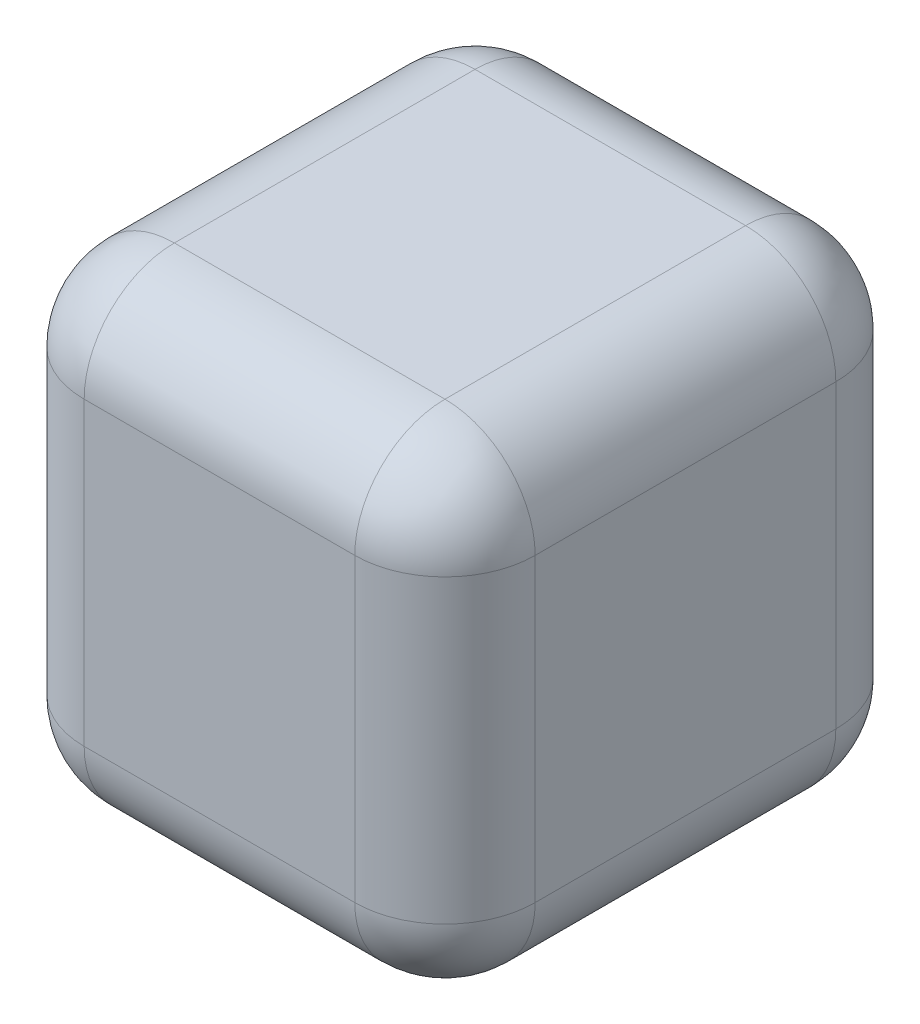
ISO-10303-21;
HEADER;
FILE_DESCRIPTION(('STEP AP214'),'2;1');
FILE_NAME('part.step','',(''),(''),'','','');
FILE_SCHEMA(('AUTOMOTIVE_DESIGN { 1 0 10303 214 1 1 1 1 }'));
ENDSEC;
DATA;
#1=APPLICATION_CONTEXT('core data for automotive mechanical design processes');
#2=APPLICATION_PROTOCOL_DEFINITION('international standard','automotive_design',2000,#1);
#3=PRODUCT_CONTEXT('',#1,'mechanical');
#4=PRODUCT('Part','Part','',(#3));
#5=PRODUCT_RELATED_PRODUCT_CATEGORY('part','',(#4));
#6=PRODUCT_DEFINITION_FORMATION('','',#4);
#7=PRODUCT_DEFINITION_CONTEXT('part definition',#1,'design');
#8=PRODUCT_DEFINITION('design','',#6,#7);
#9=PRODUCT_DEFINITION_SHAPE('','',#8);
#10=(LENGTH_UNIT() NAMED_UNIT(*) SI_UNIT(.MILLI.,.METRE.));
#11=(NAMED_UNIT(*) PLANE_ANGLE_UNIT() SI_UNIT($,.RADIAN.));
#12=(NAMED_UNIT(*) SI_UNIT($,.STERADIAN.) SOLID_ANGLE_UNIT());
#13=UNCERTAINTY_MEASURE_WITH_UNIT(LENGTH_MEASURE(1.E-05),#10,'distance_accuracy_value','');
#14=(GEOMETRIC_REPRESENTATION_CONTEXT(3) GLOBAL_UNCERTAINTY_ASSIGNED_CONTEXT((#13)) GLOBAL_UNIT_ASSIGNED_CONTEXT((#10,
#11,#12)) REPRESENTATION_CONTEXT('',''));
#15=CARTESIAN_POINT('',(0.,0.,0.));
#16=DIRECTION('',(0.,0.,1.));
#17=DIRECTION('',(1.,0.,0.));
#18=AXIS2_PLACEMENT_3D('',#15,#16,#17);
#19=CARTESIAN_POINT('',(63.5,-16.,16.));
#20=DIRECTION('',(0.,0.,-1.));
#21=DIRECTION('',(-1.,0.,0.));
#22=AXIS2_PLACEMENT_3D('',#19,#20,#21);
#23=PLANE('',#22);
#24=DIRECTION('',(0.,-1.,0.));
#25=VECTOR('',#24,1.);
#26=CARTESIAN_POINT('',(57.5,-16.,16.));
#27=LINE('',#26,#25);
#28=CARTESIAN_POINT('',(57.5,-10.,16.));
#29=VERTEX_POINT('',#28);
#30=CARTESIAN_POINT('',(57.5,10.,16.));
#31=VERTEX_POINT('',#30);
#32=EDGE_CURVE('E164',#29,#31,#27,.F.);
#33=ORIENTED_EDGE('',*,*,#32,.T.);
#34=DIRECTION('',(-1.,0.,0.));
#35=VECTOR('',#34,1.);
#36=CARTESIAN_POINT('',(63.5,10.,16.));
#37=LINE('',#36,#35);
#38=CARTESIAN_POINT('',(39.5,10.,16.));
#39=VERTEX_POINT('',#38);
#40=EDGE_CURVE('E167',#31,#39,#37,.T.);
#41=ORIENTED_EDGE('',*,*,#40,.T.);
#42=DIRECTION('',(0.,-1.,0.));
#43=VECTOR('',#42,1.);
#44=CARTESIAN_POINT('',(39.5,-16.,16.));
#45=LINE('',#44,#43);
#46=CARTESIAN_POINT('',(39.5,-10.,16.));
#47=VERTEX_POINT('',#46);
#48=EDGE_CURVE('E137',#39,#47,#45,.T.);
#49=ORIENTED_EDGE('',*,*,#48,.T.);
#50=DIRECTION('',(-1.,0.,0.));
#51=VECTOR('',#50,1.);
#52=CARTESIAN_POINT('',(63.5,-10.,16.));
#53=LINE('',#52,#51);
#54=EDGE_CURVE('E158',#47,#29,#53,.F.);
#55=ORIENTED_EDGE('',*,*,#54,.T.);
#56=EDGE_LOOP('',(#33,#41,#49,#55));
#57=FACE_BOUND('',#56,.T.);
#58=ADVANCED_FACE('F39',(#57),#23,.F.);
#59=CARTESIAN_POINT('',(63.5,-16.,16.));
#60=DIRECTION('',(0.,1.,0.));
#61=DIRECTION('',(0.,0.,1.));
#62=AXIS2_PLACEMENT_3D('',#59,#60,#61);
#63=PLANE('',#62);
#64=DIRECTION('',(0.,0.,-1.));
#65=VECTOR('',#64,1.);
#66=CARTESIAN_POINT('',(39.5,-16.,-16.));
#67=LINE('',#66,#65);
#68=CARTESIAN_POINT('',(39.5,-16.,10.));
#69=VERTEX_POINT('',#68);
#70=CARTESIAN_POINT('',(39.5,-16.,-10.));
#71=VERTEX_POINT('',#70);
#72=EDGE_CURVE('E193',#69,#71,#67,.T.);
#73=ORIENTED_EDGE('',*,*,#72,.T.);
#74=DIRECTION('',(-1.,0.,0.));
#75=VECTOR('',#74,1.);
#76=CARTESIAN_POINT('',(63.5,-16.,-10.));
#77=LINE('',#76,#75);
#78=CARTESIAN_POINT('',(57.5,-16.,-10.));
#79=VERTEX_POINT('',#78);
#80=EDGE_CURVE('E197',#71,#79,#77,.F.);
#81=ORIENTED_EDGE('',*,*,#80,.T.);
#82=DIRECTION('',(0.,0.,-1.));
#83=VECTOR('',#82,1.);
#84=CARTESIAN_POINT('',(57.5,-16.,16.));
#85=LINE('',#84,#83);
#86=CARTESIAN_POINT('',(57.5,-16.,10.));
#87=VERTEX_POINT('',#86);
#88=EDGE_CURVE('E190',#79,#87,#85,.F.);
#89=ORIENTED_EDGE('',*,*,#88,.T.);
#90=DIRECTION('',(-1.,0.,0.));
#91=VECTOR('',#90,1.);
#92=CARTESIAN_POINT('',(63.5,-16.,10.));
#93=LINE('',#92,#91);
#94=EDGE_CURVE('E187',#87,#69,#93,.T.);
#95=ORIENTED_EDGE('',*,*,#94,.T.);
#96=EDGE_LOOP('',(#73,#81,#89,#95));
#97=FACE_BOUND('',#96,.T.);
#98=ADVANCED_FACE('F378',(#97),#63,.F.);
#99=CARTESIAN_POINT('',(63.5,-16.,-16.));
#100=DIRECTION('',(0.,0.,1.));
#101=DIRECTION('',(1.,0.,0.));
#102=AXIS2_PLACEMENT_3D('',#99,#100,#101);
#103=PLANE('',#102);
#104=DIRECTION('',(0.,1.,0.));
#105=VECTOR('',#104,1.);
#106=CARTESIAN_POINT('',(39.5,16.,-16.));
#107=LINE('',#106,#105);
#108=CARTESIAN_POINT('',(39.5,-10.,-16.));
#109=VERTEX_POINT('',#108);
#110=CARTESIAN_POINT('',(39.5,10.,-16.));
#111=VERTEX_POINT('',#110);
#112=EDGE_CURVE('E206',#109,#111,#107,.T.);
#113=ORIENTED_EDGE('',*,*,#112,.T.);
#114=DIRECTION('',(-1.,0.,0.));
#115=VECTOR('',#114,1.);
#116=CARTESIAN_POINT('',(63.5,10.,-16.));
#117=LINE('',#116,#115);
#118=CARTESIAN_POINT('',(57.5,10.,-16.));
#119=VERTEX_POINT('',#118);
#120=EDGE_CURVE('E210',#111,#119,#117,.F.);
#121=ORIENTED_EDGE('',*,*,#120,.T.);
#122=DIRECTION('',(0.,1.,0.));
#123=VECTOR('',#122,1.);
#124=CARTESIAN_POINT('',(57.5,-16.,-16.));
#125=LINE('',#124,#123);
#126=CARTESIAN_POINT('',(57.5,-10.,-16.));
#127=VERTEX_POINT('',#126);
#128=EDGE_CURVE('E203',#119,#127,#125,.F.);
#129=ORIENTED_EDGE('',*,*,#128,.T.);
#130=DIRECTION('',(-1.,0.,0.));
#131=VECTOR('',#130,1.);
#132=CARTESIAN_POINT('',(63.5,-10.,-16.));
#133=LINE('',#132,#131);
#134=EDGE_CURVE('E200',#127,#109,#133,.T.);
#135=ORIENTED_EDGE('',*,*,#134,.T.);
#136=EDGE_LOOP('',(#113,#121,#129,#135));
#137=FACE_BOUND('',#136,.T.);
#138=ADVANCED_FACE('F348',(#137),#103,.F.);
#139=CARTESIAN_POINT('',(63.5,16.,16.));
#140=DIRECTION('',(0.,-1.,0.));
#141=DIRECTION('',(0.,0.,-1.));
#142=AXIS2_PLACEMENT_3D('',#139,#140,#141);
#143=PLANE('',#142);
#144=DIRECTION('',(0.,0.,1.));
#145=VECTOR('',#144,1.);
#146=CARTESIAN_POINT('',(39.5,16.,16.));
#147=LINE('',#146,#145);
#148=CARTESIAN_POINT('',(39.5,16.,-10.));
#149=VERTEX_POINT('',#148);
#150=CARTESIAN_POINT('',(39.5,16.,10.));
#151=VERTEX_POINT('',#150);
#152=EDGE_CURVE('E219',#149,#151,#147,.T.);
#153=ORIENTED_EDGE('',*,*,#152,.T.);
#154=DIRECTION('',(-1.,0.,0.));
#155=VECTOR('',#154,1.);
#156=CARTESIAN_POINT('',(63.5,16.,10.));
#157=LINE('',#156,#155);
#158=CARTESIAN_POINT('',(57.5,16.,10.));
#159=VERTEX_POINT('',#158);
#160=EDGE_CURVE('E223',#151,#159,#157,.F.);
#161=ORIENTED_EDGE('',*,*,#160,.T.);
#162=DIRECTION('',(0.,0.,1.));
#163=VECTOR('',#162,1.);
#164=CARTESIAN_POINT('',(57.5,16.,16.));
#165=LINE('',#164,#163);
#166=CARTESIAN_POINT('',(57.5,16.,-10.));
#167=VERTEX_POINT('',#166);
#168=EDGE_CURVE('E216',#159,#167,#165,.F.);
#169=ORIENTED_EDGE('',*,*,#168,.T.);
#170=DIRECTION('',(-1.,0.,0.));
#171=VECTOR('',#170,1.);
#172=CARTESIAN_POINT('',(63.5,16.,-10.));
#173=LINE('',#172,#171);
#174=EDGE_CURVE('E213',#167,#149,#173,.T.);
#175=ORIENTED_EDGE('',*,*,#174,.T.);
#176=EDGE_LOOP('',(#153,#161,#169,#175));
#177=FACE_BOUND('',#176,.T.);
#178=ADVANCED_FACE('F324',(#177),#143,.F.);
#179=CARTESIAN_POINT('',(63.5,0.,0.));
#180=DIRECTION('',(-1.,0.,0.));
#181=DIRECTION('',(0.,0.,1.));
#182=AXIS2_PLACEMENT_3D('',#179,#180,#181);
#183=PLANE('',#182);
#184=DIRECTION('',(0.,0.,1.));
#185=VECTOR('',#184,1.);
#186=CARTESIAN_POINT('',(63.5,10.,0.));
#187=LINE('',#186,#185);
#188=CARTESIAN_POINT('',(63.5,10.,-10.));
#189=VERTEX_POINT('',#188);
#190=CARTESIAN_POINT('',(63.5,10.,10.));
#191=VERTEX_POINT('',#190);
#192=EDGE_CURVE('E226',#189,#191,#187,.T.);
#193=ORIENTED_EDGE('',*,*,#192,.T.);
#194=DIRECTION('',(0.,-1.,0.));
#195=VECTOR('',#194,1.);
#196=CARTESIAN_POINT('',(63.5,0.,10.));
#197=LINE('',#196,#195);
#198=CARTESIAN_POINT('',(63.5,-10.,10.));
#199=VERTEX_POINT('',#198);
#200=EDGE_CURVE('E11',#191,#199,#197,.T.);
#201=ORIENTED_EDGE('',*,*,#200,.T.);
#202=DIRECTION('',(0.,0.,-1.));
#203=VECTOR('',#202,1.);
#204=CARTESIAN_POINT('',(63.5,-10.,0.));
#205=LINE('',#204,#203);
#206=CARTESIAN_POINT('',(63.5,-10.,-10.));
#207=VERTEX_POINT('',#206);
#208=EDGE_CURVE('E49',#199,#207,#205,.T.);
#209=ORIENTED_EDGE('',*,*,#208,.T.);
#210=DIRECTION('',(0.,1.,0.));
#211=VECTOR('',#210,1.);
#212=CARTESIAN_POINT('',(63.5,0.,-10.));
#213=LINE('',#212,#211);
#214=EDGE_CURVE('E229',#207,#189,#213,.T.);
#215=ORIENTED_EDGE('',*,*,#214,.T.);
#216=EDGE_LOOP('',(#193,#201,#209,#215));
#217=FACE_BOUND('',#216,.T.);
#218=ADVANCED_FACE('F332',(#217),#183,.F.);
#219=CARTESIAN_POINT('',(33.5,0.,0.));
#220=DIRECTION('',(-1.,0.,0.));
#221=DIRECTION('',(0.,0.,1.));
#222=AXIS2_PLACEMENT_3D('',#219,#220,#221);
#223=PLANE('',#222);
#224=CARTESIAN_POINT('',(33.5,-4.5,-4.5));
#225=DIRECTION('',(1.,0.,0.));
#226=DIRECTION('',(0.,0.,-1.));
#227=AXIS2_PLACEMENT_3D('',#224,#225,#226);
#228=CIRCLE('',#227,0.8);
#229=CARTESIAN_POINT('',(33.5,-4.5,-5.3));
#230=VERTEX_POINT('',#229);
#231=EDGE_CURVE('E661',#230,#230,#228,.T.);
#232=ORIENTED_EDGE('',*,*,#231,.T.);
#233=EDGE_LOOP('',(#232));
#234=FACE_BOUND('',#233,.T.);
#235=CARTESIAN_POINT('',(33.5,4.5,4.5));
#236=DIRECTION('',(1.,0.,0.));
#237=DIRECTION('',(0.,0.,-1.));
#238=AXIS2_PLACEMENT_3D('',#235,#236,#237);
#239=CIRCLE('',#238,0.8);
#240=CARTESIAN_POINT('',(33.5,4.5,3.7));
#241=VERTEX_POINT('',#240);
#242=EDGE_CURVE('E676',#241,#241,#239,.T.);
#243=ORIENTED_EDGE('',*,*,#242,.T.);
#244=EDGE_LOOP('',(#243));
#245=FACE_BOUND('',#244,.T.);
#246=CARTESIAN_POINT('',(33.5,4.5,-4.5));
#247=DIRECTION('',(1.,0.,0.));
#248=DIRECTION('',(0.,0.,-1.));
#249=AXIS2_PLACEMENT_3D('',#246,#247,#248);
#250=CIRCLE('',#249,0.8);
#251=CARTESIAN_POINT('',(33.5,4.5,-5.3));
#252=VERTEX_POINT('',#251);
#253=EDGE_CURVE('E670',#252,#252,#250,.T.);
#254=ORIENTED_EDGE('',*,*,#253,.T.);
#255=EDGE_LOOP('',(#254));
#256=FACE_BOUND('',#255,.T.);
#257=CARTESIAN_POINT('',(33.5,-4.5,4.5));
#258=DIRECTION('',(1.,0.,0.));
#259=DIRECTION('',(0.,0.,-1.));
#260=AXIS2_PLACEMENT_3D('',#257,#258,#259);
#261=CIRCLE('',#260,0.8);
#262=CARTESIAN_POINT('',(33.5,-4.5,3.7));
#263=VERTEX_POINT('',#262);
#264=EDGE_CURVE('E660',#263,#263,#261,.T.);
#265=ORIENTED_EDGE('',*,*,#264,.T.);
#266=EDGE_LOOP('',(#265));
#267=FACE_BOUND('',#266,.T.);
#268=DIRECTION('',(0.,0.,-1.));
#269=VECTOR('',#268,1.);
#270=CARTESIAN_POINT('',(33.5,-10.,16.));
#271=LINE('',#270,#269);
#272=CARTESIAN_POINT('',(33.5,-10.,-10.));
#273=VERTEX_POINT('',#272);
#274=CARTESIAN_POINT('',(33.5,-10.,10.));
#275=VERTEX_POINT('',#274);
#276=EDGE_CURVE('E182',#273,#275,#271,.F.);
#277=ORIENTED_EDGE('',*,*,#276,.T.);
#278=DIRECTION('',(0.,-1.,0.));
#279=VECTOR('',#278,1.);
#280=CARTESIAN_POINT('',(33.5,16.,10.));
#281=LINE('',#280,#279);
#282=CARTESIAN_POINT('',(33.5,10.,10.));
#283=VERTEX_POINT('',#282);
#284=EDGE_CURVE('E139',#275,#283,#281,.F.);
#285=ORIENTED_EDGE('',*,*,#284,.T.);
#286=DIRECTION('',(0.,0.,1.));
#287=VECTOR('',#286,1.);
#288=CARTESIAN_POINT('',(33.5,10.,-16.));
#289=LINE('',#288,#287);
#290=CARTESIAN_POINT('',(33.5,10.,-10.));
#291=VERTEX_POINT('',#290);
#292=EDGE_CURVE('E173',#283,#291,#289,.F.);
#293=ORIENTED_EDGE('',*,*,#292,.T.);
#294=DIRECTION('',(0.,1.,0.));
#295=VECTOR('',#294,1.);
#296=CARTESIAN_POINT('',(33.5,-16.,-10.));
#297=LINE('',#296,#295);
#298=EDGE_CURVE('E179',#291,#273,#297,.F.);
#299=ORIENTED_EDGE('',*,*,#298,.T.);
#300=EDGE_LOOP('',(#277,#285,#293,#299));
#301=FACE_BOUND('',#300,.T.);
#302=ADVANCED_FACE('F412',(#234,#245,#256,#267,#301),#223,.T.);
#303=CARTESIAN_POINT('',(57.5,0.,-10.));
#304=DIRECTION('',(0.,1.,0.));
#305=DIRECTION('',(0.,0.,1.));
#306=AXIS2_PLACEMENT_3D('',#303,#304,#305);
#307=CYLINDRICAL_SURFACE('',#306,6.);
#308=CARTESIAN_POINT('',(57.5,10.,-10.));
#309=DIRECTION('',(0.,1.,0.));
#310=DIRECTION('',(0.,0.,1.));
#311=AXIS2_PLACEMENT_3D('',#308,#309,#310);
#312=CIRCLE('',#311,6.);
#313=EDGE_CURVE('E43',#189,#119,#312,.T.);
#314=ORIENTED_EDGE('',*,*,#313,.F.);
#315=ORIENTED_EDGE('',*,*,#214,.F.);
#316=CARTESIAN_POINT('',(57.5,-10.,-10.));
#317=DIRECTION('',(0.,-1.,0.));
#318=DIRECTION('',(0.,0.,-1.));
#319=AXIS2_PLACEMENT_3D('',#316,#317,#318);
#320=CIRCLE('',#319,6.);
#321=EDGE_CURVE('E300',#127,#207,#320,.T.);
#322=ORIENTED_EDGE('',*,*,#321,.F.);
#323=ORIENTED_EDGE('',*,*,#128,.F.);
#324=EDGE_LOOP('',(#314,#315,#322,#323));
#325=FACE_BOUND('',#324,.T.);
#326=ADVANCED_FACE('F41',(#325),#307,.T.);
#327=CARTESIAN_POINT('',(57.5,10.,-10.));
#328=DIRECTION('',(0.,0.,-1.));
#329=DIRECTION('',(-1.,0.,0.));
#330=AXIS2_PLACEMENT_3D('',#327,#328,#329);
#331=SPHERICAL_SURFACE('',#330,6.);
#332=CARTESIAN_POINT('',(57.5,10.,-10.));
#333=DIRECTION('',(0.,0.,-1.));
#334=DIRECTION('',(-1.,0.,0.));
#335=AXIS2_PLACEMENT_3D('',#332,#333,#334);
#336=CIRCLE('',#335,6.);
#337=EDGE_CURVE('E293',#189,#167,#336,.F.);
#338=ORIENTED_EDGE('',*,*,#337,.F.);
#339=ORIENTED_EDGE('',*,*,#313,.T.);
#340=CARTESIAN_POINT('',(57.5,10.,-10.));
#341=DIRECTION('',(1.,0.,0.));
#342=DIRECTION('',(0.,0.,-1.));
#343=AXIS2_PLACEMENT_3D('',#340,#341,#342);
#344=CIRCLE('',#343,6.);
#345=EDGE_CURVE('E297',#167,#119,#344,.F.);
#346=ORIENTED_EDGE('',*,*,#345,.F.);
#347=EDGE_LOOP('',(#338,#339,#346));
#348=FACE_BOUND('',#347,.T.);
#349=ADVANCED_FACE('F313',(#348),#331,.T.);
#350=CARTESIAN_POINT('',(57.5,-10.,-10.));
#351=DIRECTION('',(1.,0.,0.));
#352=DIRECTION('',(0.,0.,-1.));
#353=AXIS2_PLACEMENT_3D('',#350,#351,#352);
#354=SPHERICAL_SURFACE('',#353,6.);
#355=CARTESIAN_POINT('',(57.5,-10.,-10.));
#356=DIRECTION('',(1.,0.,0.));
#357=DIRECTION('',(0.,0.,-1.));
#358=AXIS2_PLACEMENT_3D('',#355,#356,#357);
#359=CIRCLE('',#358,6.);
#360=EDGE_CURVE('E285',#127,#79,#359,.F.);
#361=ORIENTED_EDGE('',*,*,#360,.F.);
#362=ORIENTED_EDGE('',*,*,#321,.T.);
#363=CARTESIAN_POINT('',(57.5,-10.,-10.));
#364=DIRECTION('',(0.,0.,-1.));
#365=DIRECTION('',(-1.,0.,0.));
#366=AXIS2_PLACEMENT_3D('',#363,#364,#365);
#367=CIRCLE('',#366,6.);
#368=EDGE_CURVE('E289',#79,#207,#367,.F.);
#369=ORIENTED_EDGE('',*,*,#368,.F.);
#370=EDGE_LOOP('',(#361,#362,#369));
#371=FACE_BOUND('',#370,.T.);
#372=ADVANCED_FACE('F340',(#371),#354,.T.);
#373=CARTESIAN_POINT('',(63.5,10.,-10.));
#374=DIRECTION('',(-1.,0.,0.));
#375=DIRECTION('',(0.,0.,1.));
#376=AXIS2_PLACEMENT_3D('',#373,#374,#375);
#377=CYLINDRICAL_SURFACE('',#376,6.);
#378=ORIENTED_EDGE('',*,*,#345,.T.);
#379=ORIENTED_EDGE('',*,*,#120,.F.);
#380=CARTESIAN_POINT('',(39.5,10.,-10.));
#381=DIRECTION('',(-1.,0.,0.));
#382=DIRECTION('',(0.,0.,1.));
#383=AXIS2_PLACEMENT_3D('',#380,#381,#382);
#384=CIRCLE('',#383,6.);
#385=EDGE_CURVE('E278',#149,#111,#384,.T.);
#386=ORIENTED_EDGE('',*,*,#385,.F.);
#387=ORIENTED_EDGE('',*,*,#174,.F.);
#388=EDGE_LOOP('',(#378,#379,#386,#387));
#389=FACE_BOUND('',#388,.T.);
#390=ADVANCED_FACE('F320',(#389),#377,.T.);
#391=CARTESIAN_POINT('',(57.5,10.,0.));
#392=DIRECTION('',(0.,0.,1.));
#393=DIRECTION('',(1.,0.,0.));
#394=AXIS2_PLACEMENT_3D('',#391,#392,#393);
#395=CYLINDRICAL_SURFACE('',#394,6.);
#396=ORIENTED_EDGE('',*,*,#337,.T.);
#397=ORIENTED_EDGE('',*,*,#168,.F.);
#398=CARTESIAN_POINT('',(57.5,10.,10.));
#399=DIRECTION('',(0.,0.,1.));
#400=DIRECTION('',(1.,0.,0.));
#401=AXIS2_PLACEMENT_3D('',#398,#399,#400);
#402=CIRCLE('',#401,6.);
#403=EDGE_CURVE('E274',#191,#159,#402,.T.);
#404=ORIENTED_EDGE('',*,*,#403,.F.);
#405=ORIENTED_EDGE('',*,*,#192,.F.);
#406=EDGE_LOOP('',(#396,#397,#404,#405));
#407=FACE_BOUND('',#406,.T.);
#408=ADVANCED_FACE('F330',(#407),#395,.T.);
#409=CARTESIAN_POINT('',(57.5,0.,10.));
#410=DIRECTION('',(0.,-1.,0.));
#411=DIRECTION('',(0.,0.,-1.));
#412=AXIS2_PLACEMENT_3D('',#409,#410,#411);
#413=CYLINDRICAL_SURFACE('',#412,6.);
#414=CARTESIAN_POINT('',(57.5,-10.,10.));
#415=DIRECTION('',(0.,-1.,0.));
#416=DIRECTION('',(0.,0.,-1.));
#417=AXIS2_PLACEMENT_3D('',#414,#415,#416);
#418=CIRCLE('',#417,6.);
#419=EDGE_CURVE('E267',#199,#29,#418,.T.);
#420=ORIENTED_EDGE('',*,*,#419,.F.);
#421=ORIENTED_EDGE('',*,*,#200,.F.);
#422=CARTESIAN_POINT('',(57.5,10.,10.));
#423=DIRECTION('',(0.,1.,0.));
#424=DIRECTION('',(-1.,0.,0.));
#425=AXIS2_PLACEMENT_3D('',#422,#423,#424);
#426=CIRCLE('',#425,6.);
#427=EDGE_CURVE('E270',#31,#191,#426,.T.);
#428=ORIENTED_EDGE('',*,*,#427,.F.);
#429=ORIENTED_EDGE('',*,*,#32,.F.);
#430=EDGE_LOOP('',(#420,#421,#428,#429));
#431=FACE_BOUND('',#430,.T.);
#432=ADVANCED_FACE('F335',(#431),#413,.T.);
#433=CARTESIAN_POINT('',(57.5,-10.,0.));
#434=DIRECTION('',(0.,0.,-1.));
#435=DIRECTION('',(-1.,0.,0.));
#436=AXIS2_PLACEMENT_3D('',#433,#434,#435);
#437=CYLINDRICAL_SURFACE('',#436,6.);
#438=ORIENTED_EDGE('',*,*,#368,.T.);
#439=ORIENTED_EDGE('',*,*,#208,.F.);
#440=CARTESIAN_POINT('',(57.5,-10.,10.));
#441=DIRECTION('',(0.,0.,1.));
#442=DIRECTION('',(1.,0.,0.));
#443=AXIS2_PLACEMENT_3D('',#440,#441,#442);
#444=CIRCLE('',#443,6.);
#445=EDGE_CURVE('E57',#87,#199,#444,.T.);
#446=ORIENTED_EDGE('',*,*,#445,.F.);
#447=ORIENTED_EDGE('',*,*,#88,.F.);
#448=EDGE_LOOP('',(#438,#439,#446,#447));
#449=FACE_BOUND('',#448,.T.);
#450=ADVANCED_FACE('F338',(#449),#437,.T.);
#451=CARTESIAN_POINT('',(63.5,-10.,-10.));
#452=DIRECTION('',(-1.,0.,0.));
#453=DIRECTION('',(0.,0.,1.));
#454=AXIS2_PLACEMENT_3D('',#451,#452,#453);
#455=CYLINDRICAL_SURFACE('',#454,6.);
#456=ORIENTED_EDGE('',*,*,#360,.T.);
#457=ORIENTED_EDGE('',*,*,#80,.F.);
#458=CARTESIAN_POINT('',(39.5,-10.,-10.));
#459=DIRECTION('',(-1.,0.,0.));
#460=DIRECTION('',(0.,0.,1.));
#461=AXIS2_PLACEMENT_3D('',#458,#459,#460);
#462=CIRCLE('',#461,6.);
#463=EDGE_CURVE('E261',#109,#71,#462,.T.);
#464=ORIENTED_EDGE('',*,*,#463,.F.);
#465=ORIENTED_EDGE('',*,*,#134,.F.);
#466=EDGE_LOOP('',(#456,#457,#464,#465));
#467=FACE_BOUND('',#466,.T.);
#468=ADVANCED_FACE('F345',(#467),#455,.T.);
#469=CARTESIAN_POINT('',(39.5,-16.,-10.));
#470=DIRECTION('',(0.,-1.,0.));
#471=DIRECTION('',(0.,0.,-1.));
#472=AXIS2_PLACEMENT_3D('',#469,#470,#471);
#473=CYLINDRICAL_SURFACE('',#472,6.);
#474=CARTESIAN_POINT('',(39.5,10.,-10.));
#475=DIRECTION('',(0.,1.,0.));
#476=DIRECTION('',(0.,0.,1.));
#477=AXIS2_PLACEMENT_3D('',#474,#475,#476);
#478=CIRCLE('',#477,6.);
#479=EDGE_CURVE('E281',#111,#291,#478,.T.);
#480=ORIENTED_EDGE('',*,*,#479,.F.);
#481=ORIENTED_EDGE('',*,*,#112,.F.);
#482=CARTESIAN_POINT('',(39.5,-10.,-10.));
#483=DIRECTION('',(0.,-1.,0.));
#484=DIRECTION('',(0.,0.,-1.));
#485=AXIS2_PLACEMENT_3D('',#482,#483,#484);
#486=CIRCLE('',#485,6.);
#487=EDGE_CURVE('E257',#273,#109,#486,.T.);
#488=ORIENTED_EDGE('',*,*,#487,.F.);
#489=ORIENTED_EDGE('',*,*,#298,.F.);
#490=EDGE_LOOP('',(#480,#481,#488,#489));
#491=FACE_BOUND('',#490,.T.);
#492=ADVANCED_FACE('F352',(#491),#473,.T.);
#493=CARTESIAN_POINT('',(39.5,10.,-10.));
#494=DIRECTION('',(0.,0.,-1.));
#495=DIRECTION('',(-1.,0.,0.));
#496=AXIS2_PLACEMENT_3D('',#493,#494,#495);
#497=SPHERICAL_SURFACE('',#496,6.);
#498=ORIENTED_EDGE('',*,*,#385,.T.);
#499=ORIENTED_EDGE('',*,*,#479,.T.);
#500=CARTESIAN_POINT('',(39.5,10.,-10.));
#501=DIRECTION('',(0.,0.,-1.));
#502=DIRECTION('',(0.,1.,0.));
#503=AXIS2_PLACEMENT_3D('',#500,#501,#502);
#504=CIRCLE('',#503,6.);
#505=EDGE_CURVE('E253',#149,#291,#504,.F.);
#506=ORIENTED_EDGE('',*,*,#505,.F.);
#507=EDGE_LOOP('',(#498,#499,#506));
#508=FACE_BOUND('',#507,.T.);
#509=ADVANCED_FACE('F356',(#508),#497,.T.);
#510=CARTESIAN_POINT('',(57.5,10.,10.));
#511=DIRECTION('',(1.,0.,0.));
#512=DIRECTION('',(0.,0.,-1.));
#513=AXIS2_PLACEMENT_3D('',#510,#511,#512);
#514=SPHERICAL_SURFACE('',#513,6.);
#515=ORIENTED_EDGE('',*,*,#427,.T.);
#516=ORIENTED_EDGE('',*,*,#403,.T.);
#517=CARTESIAN_POINT('',(57.5,10.,10.));
#518=DIRECTION('',(1.,0.,0.));
#519=DIRECTION('',(0.,0.,-1.));
#520=AXIS2_PLACEMENT_3D('',#517,#518,#519);
#521=CIRCLE('',#520,6.);
#522=EDGE_CURVE('E249',#31,#159,#521,.F.);
#523=ORIENTED_EDGE('',*,*,#522,.F.);
#524=EDGE_LOOP('',(#515,#516,#523));
#525=FACE_BOUND('',#524,.T.);
#526=ADVANCED_FACE('F366',(#525),#514,.T.);
#527=CARTESIAN_POINT('',(57.5,-10.,10.));
#528=DIRECTION('',(1.,0.,0.));
#529=DIRECTION('',(0.,0.,-1.));
#530=AXIS2_PLACEMENT_3D('',#527,#528,#529);
#531=SPHERICAL_SURFACE('',#530,6.);
#532=ORIENTED_EDGE('',*,*,#445,.T.);
#533=ORIENTED_EDGE('',*,*,#419,.T.);
#534=CARTESIAN_POINT('',(57.5,-10.,10.));
#535=DIRECTION('',(1.,0.,0.));
#536=DIRECTION('',(0.,0.,-1.));
#537=AXIS2_PLACEMENT_3D('',#534,#535,#536);
#538=CIRCLE('',#537,6.);
#539=EDGE_CURVE('E160',#87,#29,#538,.F.);
#540=ORIENTED_EDGE('',*,*,#539,.F.);
#541=EDGE_LOOP('',(#532,#533,#540));
#542=FACE_BOUND('',#541,.T.);
#543=ADVANCED_FACE('F368',(#542),#531,.T.);
#544=CARTESIAN_POINT('',(39.5,-10.,-10.));
#545=DIRECTION('',(0.,0.,-1.));
#546=DIRECTION('',(-1.,0.,0.));
#547=AXIS2_PLACEMENT_3D('',#544,#545,#546);
#548=SPHERICAL_SURFACE('',#547,6.);
#549=ORIENTED_EDGE('',*,*,#487,.T.);
#550=ORIENTED_EDGE('',*,*,#463,.T.);
#551=CARTESIAN_POINT('',(39.5,-10.,-10.));
#552=DIRECTION('',(0.,0.,-1.));
#553=DIRECTION('',(-1.,0.,0.));
#554=AXIS2_PLACEMENT_3D('',#551,#552,#553);
#555=CIRCLE('',#554,6.);
#556=EDGE_CURVE('E244',#273,#71,#555,.F.);
#557=ORIENTED_EDGE('',*,*,#556,.F.);
#558=EDGE_LOOP('',(#549,#550,#557));
#559=FACE_BOUND('',#558,.T.);
#560=ADVANCED_FACE('F374',(#559),#548,.T.);
#561=CARTESIAN_POINT('',(39.5,10.,16.));
#562=DIRECTION('',(0.,0.,-1.));
#563=DIRECTION('',(-1.,0.,0.));
#564=AXIS2_PLACEMENT_3D('',#561,#562,#563);
#565=CYLINDRICAL_SURFACE('',#564,6.);
#566=ORIENTED_EDGE('',*,*,#505,.T.);
#567=ORIENTED_EDGE('',*,*,#292,.F.);
#568=CARTESIAN_POINT('',(39.5,10.,10.));
#569=DIRECTION('',(0.,0.,1.));
#570=DIRECTION('',(1.,0.,0.));
#571=AXIS2_PLACEMENT_3D('',#568,#569,#570);
#572=CIRCLE('',#571,6.);
#573=EDGE_CURVE('E240',#151,#283,#572,.T.);
#574=ORIENTED_EDGE('',*,*,#573,.F.);
#575=ORIENTED_EDGE('',*,*,#152,.F.);
#576=EDGE_LOOP('',(#566,#567,#574,#575));
#577=FACE_BOUND('',#576,.T.);
#578=ADVANCED_FACE('F359',(#577),#565,.T.);
#579=CARTESIAN_POINT('',(63.5,10.,10.));
#580=DIRECTION('',(-1.,0.,0.));
#581=DIRECTION('',(0.,0.,1.));
#582=AXIS2_PLACEMENT_3D('',#579,#580,#581);
#583=CYLINDRICAL_SURFACE('',#582,6.);
#584=ORIENTED_EDGE('',*,*,#522,.T.);
#585=ORIENTED_EDGE('',*,*,#160,.F.);
#586=CARTESIAN_POINT('',(39.5,10.,10.));
#587=DIRECTION('',(-1.,0.,0.));
#588=DIRECTION('',(0.,0.,1.));
#589=AXIS2_PLACEMENT_3D('',#586,#587,#588);
#590=CIRCLE('',#589,6.);
#591=EDGE_CURVE('E155',#39,#151,#590,.T.);
#592=ORIENTED_EDGE('',*,*,#591,.F.);
#593=ORIENTED_EDGE('',*,*,#40,.F.);
#594=EDGE_LOOP('',(#584,#585,#592,#593));
#595=FACE_BOUND('',#594,.T.);
#596=ADVANCED_FACE('F364',(#595),#583,.T.);
#597=CARTESIAN_POINT('',(63.5,-10.,10.));
#598=DIRECTION('',(-1.,0.,0.));
#599=DIRECTION('',(0.,0.,1.));
#600=AXIS2_PLACEMENT_3D('',#597,#598,#599);
#601=CYLINDRICAL_SURFACE('',#600,6.);
#602=ORIENTED_EDGE('',*,*,#539,.T.);
#603=ORIENTED_EDGE('',*,*,#54,.F.);
#604=CARTESIAN_POINT('',(39.5,-10.,10.));
#605=DIRECTION('',(-1.,0.,0.));
#606=DIRECTION('',(0.,0.,1.));
#607=AXIS2_PLACEMENT_3D('',#604,#605,#606);
#608=CIRCLE('',#607,6.);
#609=EDGE_CURVE('E147',#69,#47,#608,.T.);
#610=ORIENTED_EDGE('',*,*,#609,.F.);
#611=ORIENTED_EDGE('',*,*,#94,.F.);
#612=EDGE_LOOP('',(#602,#603,#610,#611));
#613=FACE_BOUND('',#612,.T.);
#614=ADVANCED_FACE('F159',(#613),#601,.T.);
#615=CARTESIAN_POINT('',(39.5,-10.,16.));
#616=DIRECTION('',(0.,0.,1.));
#617=DIRECTION('',(1.,0.,0.));
#618=AXIS2_PLACEMENT_3D('',#615,#616,#617);
#619=CYLINDRICAL_SURFACE('',#618,6.);
#620=ORIENTED_EDGE('',*,*,#556,.T.);
#621=ORIENTED_EDGE('',*,*,#72,.F.);
#622=CARTESIAN_POINT('',(39.5,-10.,10.));
#623=DIRECTION('',(0.,0.,1.));
#624=DIRECTION('',(1.,0.,0.));
#625=AXIS2_PLACEMENT_3D('',#622,#623,#624);
#626=CIRCLE('',#625,6.);
#627=EDGE_CURVE('E151',#275,#69,#626,.T.);
#628=ORIENTED_EDGE('',*,*,#627,.F.);
#629=ORIENTED_EDGE('',*,*,#276,.F.);
#630=EDGE_LOOP('',(#620,#621,#628,#629));
#631=FACE_BOUND('',#630,.T.);
#632=ADVANCED_FACE('F395',(#631),#619,.T.);
#633=CARTESIAN_POINT('',(39.5,10.,10.));
#634=DIRECTION('',(0.,1.,0.));
#635=DIRECTION('',(0.,0.,1.));
#636=AXIS2_PLACEMENT_3D('',#633,#634,#635);
#637=SPHERICAL_SURFACE('',#636,6.);
#638=ORIENTED_EDGE('',*,*,#591,.T.);
#639=ORIENTED_EDGE('',*,*,#573,.T.);
#640=CARTESIAN_POINT('',(39.5,10.,10.));
#641=DIRECTION('',(0.,1.,0.));
#642=DIRECTION('',(0.,0.,1.));
#643=AXIS2_PLACEMENT_3D('',#640,#641,#642);
#644=CIRCLE('',#643,6.);
#645=EDGE_CURVE('E143',#39,#283,#644,.F.);
#646=ORIENTED_EDGE('',*,*,#645,.F.);
#647=EDGE_LOOP('',(#638,#639,#646));
#648=FACE_BOUND('',#647,.T.);
#649=ADVANCED_FACE('F392',(#648),#637,.T.);
#650=CARTESIAN_POINT('',(39.5,-10.,10.));
#651=DIRECTION('',(0.,-1.,0.));
#652=DIRECTION('',(0.,0.,-1.));
#653=AXIS2_PLACEMENT_3D('',#650,#651,#652);
#654=SPHERICAL_SURFACE('',#653,6.);
#655=ORIENTED_EDGE('',*,*,#627,.T.);
#656=ORIENTED_EDGE('',*,*,#609,.T.);
#657=CARTESIAN_POINT('',(39.5,-10.,10.));
#658=DIRECTION('',(0.,-1.,0.));
#659=DIRECTION('',(0.,0.,-1.));
#660=AXIS2_PLACEMENT_3D('',#657,#658,#659);
#661=CIRCLE('',#660,6.);
#662=EDGE_CURVE('E133',#275,#47,#661,.F.);
#663=ORIENTED_EDGE('',*,*,#662,.F.);
#664=EDGE_LOOP('',(#655,#656,#663));
#665=FACE_BOUND('',#664,.T.);
#666=ADVANCED_FACE('F149',(#665),#654,.T.);
#667=CARTESIAN_POINT('',(39.5,-16.,10.));
#668=DIRECTION('',(0.,1.,0.));
#669=DIRECTION('',(0.,0.,1.));
#670=AXIS2_PLACEMENT_3D('',#667,#668,#669);
#671=CYLINDRICAL_SURFACE('',#670,6.);
#672=ORIENTED_EDGE('',*,*,#645,.T.);
#673=ORIENTED_EDGE('',*,*,#284,.F.);
#674=ORIENTED_EDGE('',*,*,#662,.T.);
#675=ORIENTED_EDGE('',*,*,#48,.F.);
#676=EDGE_LOOP('',(#672,#673,#674,#675));
#677=FACE_BOUND('',#676,.T.);
#678=ADVANCED_FACE('F135',(#677),#671,.T.);
#679=CARTESIAN_POINT('',(39.5,-4.5,4.5));
#680=DIRECTION('',(-1.,0.,0.));
#681=DIRECTION('',(0.,0.,1.));
#682=AXIS2_PLACEMENT_3D('',#679,#680,#681);
#683=CYLINDRICAL_SURFACE('',#682,0.8);
#684=CARTESIAN_POINT('',(39.5,-4.5,4.5));
#685=DIRECTION('',(1.,0.,0.));
#686=DIRECTION('',(0.,0.,-1.));
#687=AXIS2_PLACEMENT_3D('',#684,#685,#686);
#688=CIRCLE('',#687,0.8);
#689=CARTESIAN_POINT('',(39.5,-4.5,3.7));
#690=VERTEX_POINT('',#689);
#691=EDGE_CURVE('E144',#690,#690,#688,.T.);
#692=ORIENTED_EDGE('',*,*,#691,.T.);
#693=EDGE_LOOP('',(#692));
#694=FACE_BOUND('',#693,.T.);
#695=ORIENTED_EDGE('',*,*,#264,.F.);
#696=EDGE_LOOP('',(#695));
#697=FACE_BOUND('',#696,.T.);
#698=ADVANCED_FACE('F389',(#694,#697),#683,.F.);
#699=CARTESIAN_POINT('',(39.5,-4.5,4.5));
#700=DIRECTION('',(1.,0.,0.));
#701=DIRECTION('',(0.,0.,-1.));
#702=AXIS2_PLACEMENT_3D('',#699,#700,#701);
#703=PLANE('',#702);
#704=ORIENTED_EDGE('',*,*,#691,.F.);
#705=EDGE_LOOP('',(#704));
#706=FACE_BOUND('',#705,.T.);
#707=ADVANCED_FACE('F583',(#706),#703,.F.);
#708=CARTESIAN_POINT('',(39.5,4.5,-4.5));
#709=DIRECTION('',(-1.,0.,0.));
#710=DIRECTION('',(0.,0.,1.));
#711=AXIS2_PLACEMENT_3D('',#708,#709,#710);
#712=CYLINDRICAL_SURFACE('',#711,0.8);
#713=CARTESIAN_POINT('',(39.5,4.5,-4.5));
#714=DIRECTION('',(1.,0.,0.));
#715=DIRECTION('',(0.,0.,-1.));
#716=AXIS2_PLACEMENT_3D('',#713,#714,#715);
#717=CIRCLE('',#716,0.8);
#718=CARTESIAN_POINT('',(39.5,4.5,-5.3));
#719=VERTEX_POINT('',#718);
#720=EDGE_CURVE('E680',#719,#719,#717,.T.);
#721=ORIENTED_EDGE('',*,*,#720,.T.);
#722=EDGE_LOOP('',(#721));
#723=FACE_BOUND('',#722,.T.);
#724=ORIENTED_EDGE('',*,*,#253,.F.);
#725=EDGE_LOOP('',(#724));
#726=FACE_BOUND('',#725,.T.);
#727=ADVANCED_FACE('F592',(#723,#726),#712,.F.);
#728=CARTESIAN_POINT('',(39.5,4.5,-4.5));
#729=DIRECTION('',(1.,0.,0.));
#730=DIRECTION('',(0.,0.,-1.));
#731=AXIS2_PLACEMENT_3D('',#728,#729,#730);
#732=PLANE('',#731);
#733=ORIENTED_EDGE('',*,*,#720,.F.);
#734=EDGE_LOOP('',(#733));
#735=FACE_BOUND('',#734,.T.);
#736=ADVANCED_FACE('F602',(#735),#732,.F.);
#737=CARTESIAN_POINT('',(39.5,4.5,4.5));
#738=DIRECTION('',(-1.,0.,0.));
#739=DIRECTION('',(0.,0.,1.));
#740=AXIS2_PLACEMENT_3D('',#737,#738,#739);
#741=CYLINDRICAL_SURFACE('',#740,0.8);
#742=CARTESIAN_POINT('',(39.5,4.5,4.5));
#743=DIRECTION('',(1.,0.,0.));
#744=DIRECTION('',(0.,0.,-1.));
#745=AXIS2_PLACEMENT_3D('',#742,#743,#744);
#746=CIRCLE('',#745,0.8);
#747=CARTESIAN_POINT('',(39.5,4.5,3.7));
#748=VERTEX_POINT('',#747);
#749=EDGE_CURVE('E667',#748,#748,#746,.T.);
#750=ORIENTED_EDGE('',*,*,#749,.T.);
#751=EDGE_LOOP('',(#750));
#752=FACE_BOUND('',#751,.T.);
#753=ORIENTED_EDGE('',*,*,#242,.F.);
#754=EDGE_LOOP('',(#753));
#755=FACE_BOUND('',#754,.T.);
#756=ADVANCED_FACE('F612',(#752,#755),#741,.F.);
#757=CARTESIAN_POINT('',(39.5,4.5,4.5));
#758=DIRECTION('',(1.,0.,0.));
#759=DIRECTION('',(0.,0.,-1.));
#760=AXIS2_PLACEMENT_3D('',#757,#758,#759);
#761=PLANE('',#760);
#762=ORIENTED_EDGE('',*,*,#749,.F.);
#763=EDGE_LOOP('',(#762));
#764=FACE_BOUND('',#763,.T.);
#765=ADVANCED_FACE('F622',(#764),#761,.F.);
#766=CARTESIAN_POINT('',(39.5,-4.5,-4.5));
#767=DIRECTION('',(-1.,0.,0.));
#768=DIRECTION('',(0.,0.,1.));
#769=AXIS2_PLACEMENT_3D('',#766,#767,#768);
#770=CYLINDRICAL_SURFACE('',#769,0.8);
#771=CARTESIAN_POINT('',(39.5,-4.5,-4.5));
#772=DIRECTION('',(1.,0.,0.));
#773=DIRECTION('',(0.,0.,-1.));
#774=AXIS2_PLACEMENT_3D('',#771,#772,#773);
#775=CIRCLE('',#774,0.8);
#776=CARTESIAN_POINT('',(39.5,-4.5,-5.3));
#777=VERTEX_POINT('',#776);
#778=EDGE_CURVE('E658',#777,#777,#775,.T.);
#779=ORIENTED_EDGE('',*,*,#778,.T.);
#780=EDGE_LOOP('',(#779));
#781=FACE_BOUND('',#780,.T.);
#782=ORIENTED_EDGE('',*,*,#231,.F.);
#783=EDGE_LOOP('',(#782));
#784=FACE_BOUND('',#783,.T.);
#785=ADVANCED_FACE('F632',(#781,#784),#770,.F.);
#786=CARTESIAN_POINT('',(39.5,-4.5,-4.5));
#787=DIRECTION('',(1.,0.,0.));
#788=DIRECTION('',(0.,0.,-1.));
#789=AXIS2_PLACEMENT_3D('',#786,#787,#788);
#790=PLANE('',#789);
#791=ORIENTED_EDGE('',*,*,#778,.F.);
#792=EDGE_LOOP('',(#791));
#793=FACE_BOUND('',#792,.T.);
#794=ADVANCED_FACE('F642',(#793),#790,.F.);
#795=CLOSED_SHELL('',(#58,#98,#138,#178,#218,#302,#326,#349,#372,#390,#408,#432,#450,#468,#492,
#509,#526,#543,#560,#578,#596,#614,#632,#649,#666,#678,#698,#707,#727,#736,#756,#765,#785,#794));
#796=MANIFOLD_SOLID_BREP('B2',#795);
#797=ADVANCED_BREP_SHAPE_REPRESENTATION('',(#18,#796),#14);
#798=SHAPE_DEFINITION_REPRESENTATION(#9,#797);
ENDSEC;
END-ISO-10303-21;
